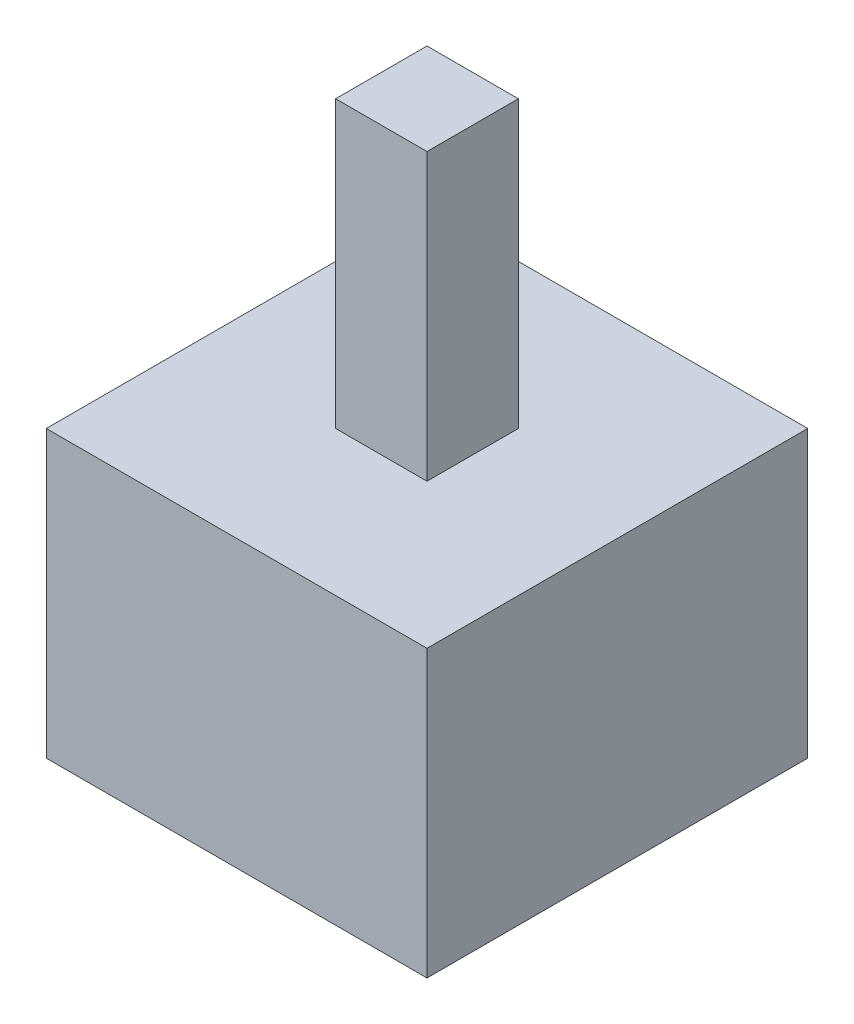
ISO-10303-21;
HEADER;
FILE_DESCRIPTION(('STEP AP214'),'2;1');
FILE_NAME('part.step','',(''),(''),'','','');
FILE_SCHEMA(('AUTOMOTIVE_DESIGN { 1 0 10303 214 1 1 1 1 }'));
ENDSEC;
DATA;
#1=APPLICATION_CONTEXT('core data for automotive mechanical design processes');
#2=APPLICATION_PROTOCOL_DEFINITION('international standard','automotive_design',2000,#1);
#3=PRODUCT_CONTEXT('',#1,'mechanical');
#4=PRODUCT('Part','Part','',(#3));
#5=PRODUCT_RELATED_PRODUCT_CATEGORY('part','',(#4));
#6=PRODUCT_DEFINITION_FORMATION('','',#4);
#7=PRODUCT_DEFINITION_CONTEXT('part definition',#1,'design');
#8=PRODUCT_DEFINITION('design','',#6,#7);
#9=PRODUCT_DEFINITION_SHAPE('','',#8);
#10=(LENGTH_UNIT() NAMED_UNIT(*) SI_UNIT(.MILLI.,.METRE.));
#11=(NAMED_UNIT(*) PLANE_ANGLE_UNIT() SI_UNIT($,.RADIAN.));
#12=(NAMED_UNIT(*) SI_UNIT($,.STERADIAN.) SOLID_ANGLE_UNIT());
#13=UNCERTAINTY_MEASURE_WITH_UNIT(LENGTH_MEASURE(1.E-05),#10,'distance_accuracy_value','');
#14=(GEOMETRIC_REPRESENTATION_CONTEXT(3) GLOBAL_UNCERTAINTY_ASSIGNED_CONTEXT((#13)) GLOBAL_UNIT_ASSIGNED_CONTEXT((#10,
#11,#12)) REPRESENTATION_CONTEXT('',''));
#15=CARTESIAN_POINT('',(0.,0.,0.));
#16=DIRECTION('',(0.,0.,1.));
#17=DIRECTION('',(1.,0.,0.));
#18=AXIS2_PLACEMENT_3D('',#15,#16,#17);
#19=CARTESIAN_POINT('',(6.35,9.525,6.35));
#20=DIRECTION('',(-1.,0.,0.));
#21=DIRECTION('',(0.,0.,1.));
#22=AXIS2_PLACEMENT_3D('',#19,#20,#21);
#23=PLANE('',#22);
#24=DIRECTION('',(0.,0.,-1.));
#25=VECTOR('',#24,1.);
#26=CARTESIAN_POINT('',(6.35,0.,6.35));
#27=LINE('',#26,#25);
#28=CARTESIAN_POINT('',(6.35,0.,6.35));
#29=VERTEX_POINT('',#28);
#30=CARTESIAN_POINT('',(6.35,0.,-6.35));
#31=VERTEX_POINT('',#30);
#32=EDGE_CURVE('E160',#29,#31,#27,.T.);
#33=ORIENTED_EDGE('',*,*,#32,.T.);
#34=DIRECTION('',(0.,-1.,0.));
#35=VECTOR('',#34,1.);
#36=CARTESIAN_POINT('',(6.35,9.525,-6.35));
#37=LINE('',#36,#35);
#38=CARTESIAN_POINT('',(6.35,9.525,-6.35));
#39=VERTEX_POINT('',#38);
#40=EDGE_CURVE('E13',#39,#31,#37,.T.);
#41=ORIENTED_EDGE('',*,*,#40,.F.);
#42=DIRECTION('',(0.,0.,-1.));
#43=VECTOR('',#42,1.);
#44=CARTESIAN_POINT('',(6.35,9.525,6.35));
#45=LINE('',#44,#43);
#46=CARTESIAN_POINT('',(6.35,9.525,6.35));
#47=VERTEX_POINT('',#46);
#48=EDGE_CURVE('E164',#47,#39,#45,.T.);
#49=ORIENTED_EDGE('',*,*,#48,.F.);
#50=DIRECTION('',(0.,-1.,0.));
#51=VECTOR('',#50,1.);
#52=CARTESIAN_POINT('',(6.35,9.525,6.35));
#53=LINE('',#52,#51);
#54=EDGE_CURVE('E170',#47,#29,#53,.T.);
#55=ORIENTED_EDGE('',*,*,#54,.T.);
#56=EDGE_LOOP('',(#33,#41,#49,#55));
#57=FACE_BOUND('',#56,.T.);
#58=ADVANCED_FACE('F47',(#57),#23,.F.);
#59=CARTESIAN_POINT('',(-6.35,9.525,-6.35));
#60=DIRECTION('',(0.,0.,1.));
#61=DIRECTION('',(1.,0.,0.));
#62=AXIS2_PLACEMENT_3D('',#59,#60,#61);
#63=PLANE('',#62);
#64=DIRECTION('',(-1.,0.,0.));
#65=VECTOR('',#64,1.);
#66=CARTESIAN_POINT('',(-6.35,0.,-6.35));
#67=LINE('',#66,#65);
#68=CARTESIAN_POINT('',(-6.35,0.,-6.35));
#69=VERTEX_POINT('',#68);
#70=EDGE_CURVE('E173',#31,#69,#67,.T.);
#71=ORIENTED_EDGE('',*,*,#70,.T.);
#72=DIRECTION('',(0.,-1.,0.));
#73=VECTOR('',#72,1.);
#74=CARTESIAN_POINT('',(-6.35,9.525,-6.35));
#75=LINE('',#74,#73);
#76=CARTESIAN_POINT('',(-6.35,9.525,-6.35));
#77=VERTEX_POINT('',#76);
#78=EDGE_CURVE('E54',#77,#69,#75,.T.);
#79=ORIENTED_EDGE('',*,*,#78,.F.);
#80=DIRECTION('',(-1.,0.,0.));
#81=VECTOR('',#80,1.);
#82=CARTESIAN_POINT('',(-6.35,9.525,-6.35));
#83=LINE('',#82,#81);
#84=EDGE_CURVE('E98',#39,#77,#83,.T.);
#85=ORIENTED_EDGE('',*,*,#84,.F.);
#86=ORIENTED_EDGE('',*,*,#40,.T.);
#87=EDGE_LOOP('',(#71,#79,#85,#86));
#88=FACE_BOUND('',#87,.T.);
#89=ADVANCED_FACE('F202',(#88),#63,.F.);
#90=CARTESIAN_POINT('',(-6.35,9.525,6.35));
#91=DIRECTION('',(1.,0.,0.));
#92=DIRECTION('',(0.,0.,-1.));
#93=AXIS2_PLACEMENT_3D('',#90,#91,#92);
#94=PLANE('',#93);
#95=DIRECTION('',(0.,0.,1.));
#96=VECTOR('',#95,1.);
#97=CARTESIAN_POINT('',(-6.35,0.,6.35));
#98=LINE('',#97,#96);
#99=CARTESIAN_POINT('',(-6.35,0.,6.35));
#100=VERTEX_POINT('',#99);
#101=EDGE_CURVE('E175',#69,#100,#98,.T.);
#102=ORIENTED_EDGE('',*,*,#101,.T.);
#103=DIRECTION('',(0.,-1.,0.));
#104=VECTOR('',#103,1.);
#105=CARTESIAN_POINT('',(-6.35,9.525,6.35));
#106=LINE('',#105,#104);
#107=CARTESIAN_POINT('',(-6.35,9.525,6.35));
#108=VERTEX_POINT('',#107);
#109=EDGE_CURVE('E179',#108,#100,#106,.T.);
#110=ORIENTED_EDGE('',*,*,#109,.F.);
#111=DIRECTION('',(0.,0.,1.));
#112=VECTOR('',#111,1.);
#113=CARTESIAN_POINT('',(-6.35,9.525,6.35));
#114=LINE('',#113,#112);
#115=EDGE_CURVE('E167',#77,#108,#114,.T.);
#116=ORIENTED_EDGE('',*,*,#115,.F.);
#117=ORIENTED_EDGE('',*,*,#78,.T.);
#118=EDGE_LOOP('',(#102,#110,#116,#117));
#119=FACE_BOUND('',#118,.T.);
#120=ADVANCED_FACE('F184',(#119),#94,.F.);
#121=CARTESIAN_POINT('',(-6.35,9.525,6.35));
#122=DIRECTION('',(0.,0.,-1.));
#123=DIRECTION('',(-1.,0.,0.));
#124=AXIS2_PLACEMENT_3D('',#121,#122,#123);
#125=PLANE('',#124);
#126=DIRECTION('',(1.,0.,0.));
#127=VECTOR('',#126,1.);
#128=CARTESIAN_POINT('',(-6.35,0.,6.35));
#129=LINE('',#128,#127);
#130=EDGE_CURVE('E91',#100,#29,#129,.T.);
#131=ORIENTED_EDGE('',*,*,#130,.T.);
#132=ORIENTED_EDGE('',*,*,#54,.F.);
#133=DIRECTION('',(1.,0.,0.));
#134=VECTOR('',#133,1.);
#135=CARTESIAN_POINT('',(-6.35,9.525,6.35));
#136=LINE('',#135,#134);
#137=EDGE_CURVE('E70',#108,#47,#136,.T.);
#138=ORIENTED_EDGE('',*,*,#137,.F.);
#139=ORIENTED_EDGE('',*,*,#109,.T.);
#140=EDGE_LOOP('',(#131,#132,#138,#139));
#141=FACE_BOUND('',#140,.T.);
#142=ADVANCED_FACE('F192',(#141),#125,.F.);
#143=CARTESIAN_POINT('',(0.,9.525,0.));
#144=DIRECTION('',(0.,-1.,0.));
#145=DIRECTION('',(0.,0.,-1.));
#146=AXIS2_PLACEMENT_3D('',#143,#144,#145);
#147=PLANE('',#146);
#148=DIRECTION('',(0.,0.,1.));
#149=VECTOR('',#148,1.);
#150=CARTESIAN_POINT('',(-1.524,9.525,-1.524));
#151=LINE('',#150,#149);
#152=CARTESIAN_POINT('',(-1.524,9.525,-1.524));
#153=VERTEX_POINT('',#152);
#154=CARTESIAN_POINT('',(-1.524,9.525,1.524));
#155=VERTEX_POINT('',#154);
#156=EDGE_CURVE('E145',#153,#155,#151,.T.);
#157=ORIENTED_EDGE('',*,*,#156,.F.);
#158=DIRECTION('',(1.,0.,0.));
#159=VECTOR('',#158,1.);
#160=CARTESIAN_POINT('',(-1.524,9.525,-1.524));
#161=LINE('',#160,#159);
#162=CARTESIAN_POINT('',(1.524,9.525,-1.524));
#163=VERTEX_POINT('',#162);
#164=EDGE_CURVE('E154',#153,#163,#161,.T.);
#165=ORIENTED_EDGE('',*,*,#164,.T.);
#166=DIRECTION('',(0.,0.,1.));
#167=VECTOR('',#166,1.);
#168=CARTESIAN_POINT('',(1.524,9.525,-1.524));
#169=LINE('',#168,#167);
#170=CARTESIAN_POINT('',(1.524,9.525,1.524));
#171=VERTEX_POINT('',#170);
#172=EDGE_CURVE('E127',#163,#171,#169,.T.);
#173=ORIENTED_EDGE('',*,*,#172,.T.);
#174=DIRECTION('',(1.,0.,0.));
#175=VECTOR('',#174,1.);
#176=CARTESIAN_POINT('',(-1.524,9.525,1.524));
#177=LINE('',#176,#175);
#178=EDGE_CURVE('E61',#155,#171,#177,.T.);
#179=ORIENTED_EDGE('',*,*,#178,.F.);
#180=EDGE_LOOP('',(#157,#165,#173,#179));
#181=FACE_BOUND('',#180,.T.);
#182=ORIENTED_EDGE('',*,*,#48,.T.);
#183=ORIENTED_EDGE('',*,*,#84,.T.);
#184=ORIENTED_EDGE('',*,*,#115,.T.);
#185=ORIENTED_EDGE('',*,*,#137,.T.);
#186=EDGE_LOOP('',(#182,#183,#184,#185));
#187=FACE_BOUND('',#186,.T.);
#188=ADVANCED_FACE('F194',(#181,#187),#147,.F.);
#189=CARTESIAN_POINT('',(0.,0.,0.));
#190=DIRECTION('',(0.,-1.,0.));
#191=DIRECTION('',(0.,0.,-1.));
#192=AXIS2_PLACEMENT_3D('',#189,#190,#191);
#193=PLANE('',#192);
#194=CARTESIAN_POINT('',(0.,0.,0.));
#195=DIRECTION('',(0.,-1.,0.));
#196=DIRECTION('',(0.,0.,-1.));
#197=AXIS2_PLACEMENT_3D('',#194,#195,#196);
#198=CIRCLE('',#197,3.175);
#199=CARTESIAN_POINT('',(0.,0.,-3.175));
#200=VERTEX_POINT('',#199);
#201=EDGE_CURVE('E149',#200,#200,#198,.T.);
#202=ORIENTED_EDGE('',*,*,#201,.F.);
#203=EDGE_LOOP('',(#202));
#204=FACE_BOUND('',#203,.T.);
#205=ORIENTED_EDGE('',*,*,#32,.F.);
#206=ORIENTED_EDGE('',*,*,#130,.F.);
#207=ORIENTED_EDGE('',*,*,#101,.F.);
#208=ORIENTED_EDGE('',*,*,#70,.F.);
#209=EDGE_LOOP('',(#205,#206,#207,#208));
#210=FACE_BOUND('',#209,.T.);
#211=ADVANCED_FACE('F188',(#204,#210),#193,.T.);
#212=CARTESIAN_POINT('',(-1.524,19.05,-1.524));
#213=DIRECTION('',(0.,0.,-1.));
#214=DIRECTION('',(-1.,0.,0.));
#215=AXIS2_PLACEMENT_3D('',#212,#213,#214);
#216=PLANE('',#215);
#217=ORIENTED_EDGE('',*,*,#164,.F.);
#218=DIRECTION('',(0.,-1.,0.));
#219=VECTOR('',#218,1.);
#220=CARTESIAN_POINT('',(-1.524,19.05,-1.524));
#221=LINE('',#220,#219);
#222=CARTESIAN_POINT('',(-1.524,19.05,-1.524));
#223=VERTEX_POINT('',#222);
#224=EDGE_CURVE('E143',#223,#153,#221,.T.);
#225=ORIENTED_EDGE('',*,*,#224,.F.);
#226=DIRECTION('',(1.,0.,0.));
#227=VECTOR('',#226,1.);
#228=CARTESIAN_POINT('',(-1.524,19.05,-1.524));
#229=LINE('',#228,#227);
#230=CARTESIAN_POINT('',(1.524,19.05,-1.524));
#231=VERTEX_POINT('',#230);
#232=EDGE_CURVE('E138',#223,#231,#229,.T.);
#233=ORIENTED_EDGE('',*,*,#232,.T.);
#234=DIRECTION('',(0.,-1.,0.));
#235=VECTOR('',#234,1.);
#236=CARTESIAN_POINT('',(1.524,19.05,-1.524));
#237=LINE('',#236,#235);
#238=EDGE_CURVE('E122',#231,#163,#237,.T.);
#239=ORIENTED_EDGE('',*,*,#238,.T.);
#240=EDGE_LOOP('',(#217,#225,#233,#239));
#241=FACE_BOUND('',#240,.T.);
#242=ADVANCED_FACE('F142',(#241),#216,.T.);
#243=CARTESIAN_POINT('',(-1.524,19.05,-1.524));
#244=DIRECTION('',(1.,0.,0.));
#245=DIRECTION('',(0.,0.,-1.));
#246=AXIS2_PLACEMENT_3D('',#243,#244,#245);
#247=PLANE('',#246);
#248=ORIENTED_EDGE('',*,*,#156,.T.);
#249=DIRECTION('',(0.,-1.,0.));
#250=VECTOR('',#249,1.);
#251=CARTESIAN_POINT('',(-1.524,19.05,1.524));
#252=LINE('',#251,#250);
#253=CARTESIAN_POINT('',(-1.524,19.05,1.524));
#254=VERTEX_POINT('',#253);
#255=EDGE_CURVE('E161',#254,#155,#252,.T.);
#256=ORIENTED_EDGE('',*,*,#255,.F.);
#257=DIRECTION('',(0.,0.,1.));
#258=VECTOR('',#257,1.);
#259=CARTESIAN_POINT('',(-1.524,19.05,-1.524));
#260=LINE('',#259,#258);
#261=EDGE_CURVE('E133',#223,#254,#260,.T.);
#262=ORIENTED_EDGE('',*,*,#261,.F.);
#263=ORIENTED_EDGE('',*,*,#224,.T.);
#264=EDGE_LOOP('',(#248,#256,#262,#263));
#265=FACE_BOUND('',#264,.T.);
#266=ADVANCED_FACE('F236',(#265),#247,.F.);
#267=CARTESIAN_POINT('',(-1.524,19.05,1.524));
#268=DIRECTION('',(0.,0.,-1.));
#269=DIRECTION('',(-1.,0.,0.));
#270=AXIS2_PLACEMENT_3D('',#267,#268,#269);
#271=PLANE('',#270);
#272=ORIENTED_EDGE('',*,*,#178,.T.);
#273=DIRECTION('',(0.,-1.,0.));
#274=VECTOR('',#273,1.);
#275=CARTESIAN_POINT('',(1.524,19.05,1.524));
#276=LINE('',#275,#274);
#277=CARTESIAN_POINT('',(1.524,19.05,1.524));
#278=VERTEX_POINT('',#277);
#279=EDGE_CURVE('E132',#278,#171,#276,.T.);
#280=ORIENTED_EDGE('',*,*,#279,.F.);
#281=DIRECTION('',(1.,0.,0.));
#282=VECTOR('',#281,1.);
#283=CARTESIAN_POINT('',(-1.524,19.05,1.524));
#284=LINE('',#283,#282);
#285=EDGE_CURVE('E140',#254,#278,#284,.T.);
#286=ORIENTED_EDGE('',*,*,#285,.F.);
#287=ORIENTED_EDGE('',*,*,#255,.T.);
#288=EDGE_LOOP('',(#272,#280,#286,#287));
#289=FACE_BOUND('',#288,.T.);
#290=ADVANCED_FACE('F245',(#289),#271,.F.);
#291=CARTESIAN_POINT('',(1.524,19.05,-1.524));
#292=DIRECTION('',(1.,0.,0.));
#293=DIRECTION('',(0.,0.,-1.));
#294=AXIS2_PLACEMENT_3D('',#291,#292,#293);
#295=PLANE('',#294);
#296=ORIENTED_EDGE('',*,*,#172,.F.);
#297=ORIENTED_EDGE('',*,*,#238,.F.);
#298=DIRECTION('',(0.,0.,1.));
#299=VECTOR('',#298,1.);
#300=CARTESIAN_POINT('',(1.524,19.05,-1.524));
#301=LINE('',#300,#299);
#302=EDGE_CURVE('E125',#231,#278,#301,.T.);
#303=ORIENTED_EDGE('',*,*,#302,.T.);
#304=ORIENTED_EDGE('',*,*,#279,.T.);
#305=EDGE_LOOP('',(#296,#297,#303,#304));
#306=FACE_BOUND('',#305,.T.);
#307=ADVANCED_FACE('F124',(#306),#295,.T.);
#308=CARTESIAN_POINT('',(0.,19.05,0.));
#309=DIRECTION('',(0.,-1.,0.));
#310=DIRECTION('',(0.,0.,-1.));
#311=AXIS2_PLACEMENT_3D('',#308,#309,#310);
#312=PLANE('',#311);
#313=ORIENTED_EDGE('',*,*,#232,.F.);
#314=ORIENTED_EDGE('',*,*,#261,.T.);
#315=ORIENTED_EDGE('',*,*,#285,.T.);
#316=ORIENTED_EDGE('',*,*,#302,.F.);
#317=EDGE_LOOP('',(#313,#314,#315,#316));
#318=FACE_BOUND('',#317,.T.);
#319=ADVANCED_FACE('F137',(#318),#312,.F.);
#320=CARTESIAN_POINT('',(0.,6.35,0.));
#321=DIRECTION('',(0.,-1.,0.));
#322=DIRECTION('',(0.,0.,-1.));
#323=AXIS2_PLACEMENT_3D('',#320,#321,#322);
#324=CYLINDRICAL_SURFACE('',#323,3.175);
#325=CARTESIAN_POINT('',(0.,6.35,0.));
#326=DIRECTION('',(0.,-1.,0.));
#327=DIRECTION('',(0.,0.,-1.));
#328=AXIS2_PLACEMENT_3D('',#325,#326,#327);
#329=CIRCLE('',#328,3.175);
#330=CARTESIAN_POINT('',(0.,6.35,-3.175));
#331=VERTEX_POINT('',#330);
#332=EDGE_CURVE('E156',#331,#331,#329,.T.);
#333=ORIENTED_EDGE('',*,*,#332,.F.);
#334=EDGE_LOOP('',(#333));
#335=FACE_BOUND('',#334,.T.);
#336=ORIENTED_EDGE('',*,*,#201,.T.);
#337=EDGE_LOOP('',(#336));
#338=FACE_BOUND('',#337,.T.);
#339=ADVANCED_FACE('F271',(#335,#338),#324,.F.);
#340=CARTESIAN_POINT('',(0.,6.35,0.));
#341=DIRECTION('',(0.,-1.,0.));
#342=DIRECTION('',(0.,0.,-1.));
#343=AXIS2_PLACEMENT_3D('',#340,#341,#342);
#344=PLANE('',#343);
#345=ORIENTED_EDGE('',*,*,#332,.T.);
#346=EDGE_LOOP('',(#345));
#347=FACE_BOUND('',#346,.T.);
#348=ADVANCED_FACE('F286',(#347),#344,.T.);
#349=CLOSED_SHELL('',(#58,#89,#120,#142,#188,#211,#242,#266,#290,#307,#319,#339,#348));
#350=MANIFOLD_SOLID_BREP('B2',#349);
#351=ADVANCED_BREP_SHAPE_REPRESENTATION('',(#18,#350),#14);
#352=SHAPE_DEFINITION_REPRESENTATION(#9,#351);
ENDSEC;
END-ISO-10303-21;
